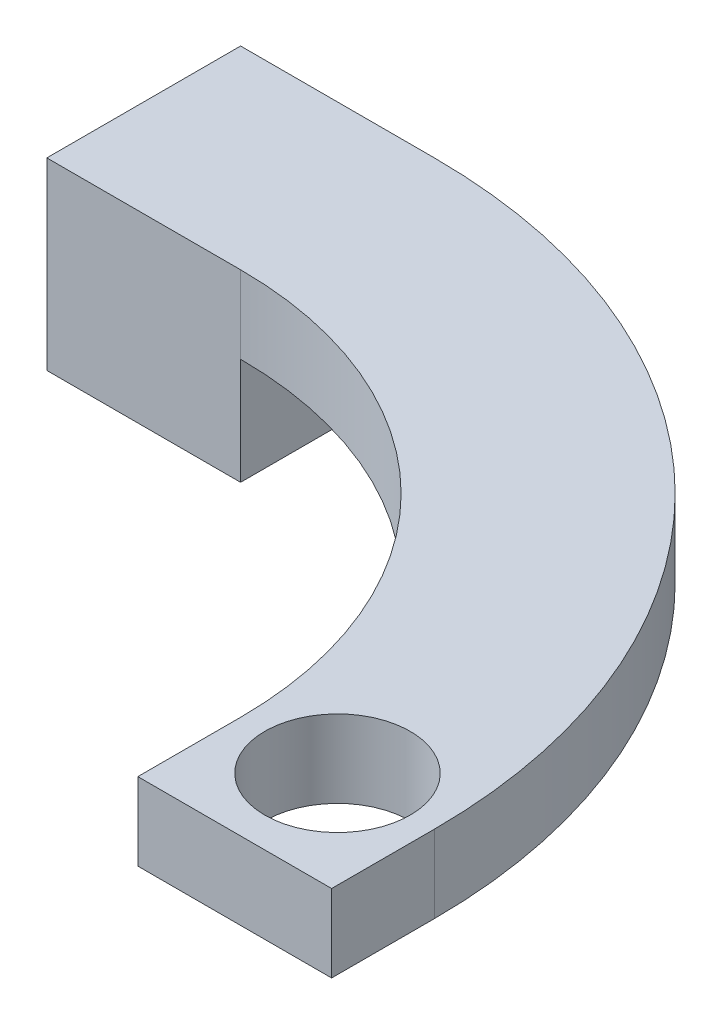
ISO-10303-21;
HEADER;
FILE_DESCRIPTION(('STEP AP214'),'2;1');
FILE_NAME('part.step','',(''),(''),'','','');
FILE_SCHEMA(('AUTOMOTIVE_DESIGN { 1 0 10303 214 1 1 1 1 }'));
ENDSEC;
DATA;
#1=APPLICATION_CONTEXT('core data for automotive mechanical design processes');
#2=APPLICATION_PROTOCOL_DEFINITION('international standard','automotive_design',2000,#1);
#3=PRODUCT_CONTEXT('',#1,'mechanical');
#4=PRODUCT('Part','Part','',(#3));
#5=PRODUCT_RELATED_PRODUCT_CATEGORY('part','',(#4));
#6=PRODUCT_DEFINITION_FORMATION('','',#4);
#7=PRODUCT_DEFINITION_CONTEXT('part definition',#1,'design');
#8=PRODUCT_DEFINITION('design','',#6,#7);
#9=PRODUCT_DEFINITION_SHAPE('','',#8);
#10=(LENGTH_UNIT() NAMED_UNIT(*) SI_UNIT(.MILLI.,.METRE.));
#11=(NAMED_UNIT(*) PLANE_ANGLE_UNIT() SI_UNIT($,.RADIAN.));
#12=(NAMED_UNIT(*) SI_UNIT($,.STERADIAN.) SOLID_ANGLE_UNIT());
#13=UNCERTAINTY_MEASURE_WITH_UNIT(LENGTH_MEASURE(1.E-05),#10,'distance_accuracy_value','');
#14=(GEOMETRIC_REPRESENTATION_CONTEXT(3) GLOBAL_UNCERTAINTY_ASSIGNED_CONTEXT((#13)) GLOBAL_UNIT_ASSIGNED_CONTEXT((#10,
#11,#12)) REPRESENTATION_CONTEXT('',''));
#15=CARTESIAN_POINT('',(0.,0.,0.));
#16=DIRECTION('',(0.,0.,1.));
#17=DIRECTION('',(1.,0.,0.));
#18=AXIS2_PLACEMENT_3D('',#15,#16,#17);
#19=CARTESIAN_POINT('',(0.,0.,0.));
#20=DIRECTION('',(0.,1.,0.));
#21=DIRECTION('',(0.,0.,1.));
#22=AXIS2_PLACEMENT_3D('',#19,#20,#21);
#23=PLANE('',#22);
#24=CARTESIAN_POINT('',(60.6066017177982,0.,-10.6066017177982));
#25=DIRECTION('',(0.,1.,0.));
#26=DIRECTION('',(0.,0.,1.));
#27=AXIS2_PLACEMENT_3D('',#24,#25,#26);
#28=CIRCLE('',#27,7.50000000000001);
#29=CARTESIAN_POINT('',(60.6066017177982,0.,-3.1066017177982));
#30=VERTEX_POINT('',#29);
#31=EDGE_CURVE('E129',#30,#30,#28,.T.);
#32=ORIENTED_EDGE('',*,*,#31,.T.);
#33=EDGE_LOOP('',(#32));
#34=FACE_BOUND('',#33,.T.);
#35=DIRECTION('',(0.,0.,1.));
#36=VECTOR('',#35,1.);
#37=CARTESIAN_POINT('',(10.6066017177982,0.,-50.6066017177982));
#38=LINE('',#37,#36);
#39=CARTESIAN_POINT('',(10.6066017177982,0.,-70.6066017177982));
#40=VERTEX_POINT('',#39);
#41=CARTESIAN_POINT('',(10.6066017177982,0.,-50.6066017177982));
#42=VERTEX_POINT('',#41);
#43=EDGE_CURVE('E166',#40,#42,#38,.T.);
#44=ORIENTED_EDGE('',*,*,#43,.F.);
#45=CARTESIAN_POINT('',(10.6066017177982,0.,-10.6066017177982));
#46=DIRECTION('',(0.,1.,0.));
#47=DIRECTION('',(0.,0.,1.));
#48=AXIS2_PLACEMENT_3D('',#45,#46,#47);
#49=CIRCLE('',#48,60.);
#50=CARTESIAN_POINT('',(70.6066017177982,0.,-10.6066017177982));
#51=VERTEX_POINT('',#50);
#52=EDGE_CURVE('E136',#51,#40,#49,.T.);
#53=ORIENTED_EDGE('',*,*,#52,.F.);
#54=DIRECTION('',(0.,0.,-1.));
#55=VECTOR('',#54,1.);
#56=CARTESIAN_POINT('',(70.6066017177982,0.,0.));
#57=LINE('',#56,#55);
#58=CARTESIAN_POINT('',(70.6066017177982,0.,0.));
#59=VERTEX_POINT('',#58);
#60=EDGE_CURVE('E132',#59,#51,#57,.T.);
#61=ORIENTED_EDGE('',*,*,#60,.F.);
#62=DIRECTION('',(1.,0.,0.));
#63=VECTOR('',#62,1.);
#64=CARTESIAN_POINT('',(0.,0.,0.));
#65=LINE('',#64,#63);
#66=CARTESIAN_POINT('',(50.6066017177982,0.,0.));
#67=VERTEX_POINT('',#66);
#68=EDGE_CURVE('E78',#67,#59,#65,.T.);
#69=ORIENTED_EDGE('',*,*,#68,.F.);
#70=DIRECTION('',(0.,0.,1.));
#71=VECTOR('',#70,1.);
#72=CARTESIAN_POINT('',(50.6066017177982,0.,0.));
#73=LINE('',#72,#71);
#74=CARTESIAN_POINT('',(50.6066017177982,0.,-10.6066017177982));
#75=VERTEX_POINT('',#74);
#76=EDGE_CURVE('E72',#75,#67,#73,.T.);
#77=ORIENTED_EDGE('',*,*,#76,.F.);
#78=CARTESIAN_POINT('',(10.6066017177982,0.,-10.6066017177982));
#79=DIRECTION('',(0.,1.,0.));
#80=DIRECTION('',(0.,0.,1.));
#81=AXIS2_PLACEMENT_3D('',#78,#79,#80);
#82=CIRCLE('',#81,40.);
#83=EDGE_CURVE('E111',#75,#42,#82,.T.);
#84=ORIENTED_EDGE('',*,*,#83,.T.);
#85=EDGE_LOOP('',(#44,#53,#61,#69,#77,#84));
#86=FACE_BOUND('',#85,.T.);
#87=ADVANCED_FACE('F35',(#34,#86),#23,.F.);
#88=CARTESIAN_POINT('',(70.6066017177982,8.,0.));
#89=DIRECTION('',(-1.,0.,0.));
#90=DIRECTION('',(0.,0.,1.));
#91=AXIS2_PLACEMENT_3D('',#88,#89,#90);
#92=PLANE('',#91);
#93=ORIENTED_EDGE('',*,*,#60,.T.);
#94=DIRECTION('',(0.,-1.,0.));
#95=VECTOR('',#94,1.);
#96=CARTESIAN_POINT('',(70.6066017177982,8.,-10.6066017177982));
#97=LINE('',#96,#95);
#98=CARTESIAN_POINT('',(70.6066017177982,8.,-10.6066017177982));
#99=VERTEX_POINT('',#98);
#100=EDGE_CURVE('E11',#99,#51,#97,.T.);
#101=ORIENTED_EDGE('',*,*,#100,.F.);
#102=DIRECTION('',(0.,0.,-1.));
#103=VECTOR('',#102,1.);
#104=CARTESIAN_POINT('',(70.6066017177982,8.,0.));
#105=LINE('',#104,#103);
#106=CARTESIAN_POINT('',(70.6066017177982,8.,0.));
#107=VERTEX_POINT('',#106);
#108=EDGE_CURVE('E178',#107,#99,#105,.T.);
#109=ORIENTED_EDGE('',*,*,#108,.F.);
#110=DIRECTION('',(0.,-1.,0.));
#111=VECTOR('',#110,1.);
#112=CARTESIAN_POINT('',(70.6066017177982,8.,0.));
#113=LINE('',#112,#111);
#114=EDGE_CURVE('E128',#107,#59,#113,.T.);
#115=ORIENTED_EDGE('',*,*,#114,.T.);
#116=EDGE_LOOP('',(#93,#101,#109,#115));
#117=FACE_BOUND('',#116,.T.);
#118=ADVANCED_FACE('F263',(#117),#92,.F.);
#119=CARTESIAN_POINT('',(10.6066017177982,8.,-10.6066017177982));
#120=DIRECTION('',(0.,-1.,0.));
#121=DIRECTION('',(0.,0.,-1.));
#122=AXIS2_PLACEMENT_3D('',#119,#120,#121);
#123=CYLINDRICAL_SURFACE('',#122,60.);
#124=ORIENTED_EDGE('',*,*,#52,.T.);
#125=DIRECTION('',(0.,-1.,0.));
#126=VECTOR('',#125,1.);
#127=CARTESIAN_POINT('',(10.6066017177982,8.,-70.6066017177982));
#128=LINE('',#127,#126);
#129=CARTESIAN_POINT('',(10.6066017177982,8.,-70.6066017177982));
#130=VERTEX_POINT('',#129);
#131=EDGE_CURVE('E44',#130,#40,#128,.T.);
#132=ORIENTED_EDGE('',*,*,#131,.F.);
#133=CARTESIAN_POINT('',(10.6066017177982,8.,-10.6066017177982));
#134=DIRECTION('',(0.,1.,0.));
#135=DIRECTION('',(0.,0.,1.));
#136=AXIS2_PLACEMENT_3D('',#133,#134,#135);
#137=CIRCLE('',#136,60.);
#138=EDGE_CURVE('E86',#99,#130,#137,.T.);
#139=ORIENTED_EDGE('',*,*,#138,.F.);
#140=ORIENTED_EDGE('',*,*,#100,.T.);
#141=EDGE_LOOP('',(#124,#132,#139,#140));
#142=FACE_BOUND('',#141,.T.);
#143=ADVANCED_FACE('F269',(#142),#123,.T.);
#144=CARTESIAN_POINT('',(0.,8.,-70.6066017177982));
#145=DIRECTION('',(0.,0.,1.));
#146=DIRECTION('',(1.,0.,0.));
#147=AXIS2_PLACEMENT_3D('',#144,#145,#146);
#148=PLANE('',#147);
#149=ORIENTED_EDGE('',*,*,#131,.T.);
#150=DIRECTION('',(0.,1.,0.));
#151=VECTOR('',#150,1.);
#152=CARTESIAN_POINT('',(10.6066017177982,-11.,-70.6066017177982));
#153=LINE('',#152,#151);
#154=CARTESIAN_POINT('',(10.6066017177982,-11.,-70.6066017177982));
#155=VERTEX_POINT('',#154);
#156=EDGE_CURVE('E133',#155,#40,#153,.T.);
#157=ORIENTED_EDGE('',*,*,#156,.F.);
#158=DIRECTION('',(1.,0.,0.));
#159=VECTOR('',#158,1.);
#160=CARTESIAN_POINT('',(-9.39339828220177,-11.,-70.6066017177982));
#161=LINE('',#160,#159);
#162=CARTESIAN_POINT('',(-9.39339828220177,-11.,-70.6066017177982));
#163=VERTEX_POINT('',#162);
#164=EDGE_CURVE('E201',#163,#155,#161,.T.);
#165=ORIENTED_EDGE('',*,*,#164,.F.);
#166=DIRECTION('',(0.,-1.,0.));
#167=VECTOR('',#166,1.);
#168=CARTESIAN_POINT('',(-9.39339828220177,8.,-70.6066017177982));
#169=LINE('',#168,#167);
#170=CARTESIAN_POINT('',(-9.39339828220177,8.,-70.6066017177982));
#171=VERTEX_POINT('',#170);
#172=EDGE_CURVE('E149',#171,#163,#169,.T.);
#173=ORIENTED_EDGE('',*,*,#172,.F.);
#174=DIRECTION('',(-1.,0.,0.));
#175=VECTOR('',#174,1.);
#176=CARTESIAN_POINT('',(0.,8.,-70.6066017177982));
#177=LINE('',#176,#175);
#178=EDGE_CURVE('E161',#130,#171,#177,.T.);
#179=ORIENTED_EDGE('',*,*,#178,.F.);
#180=EDGE_LOOP('',(#149,#157,#165,#173,#179));
#181=FACE_BOUND('',#180,.T.);
#182=ADVANCED_FACE('F156',(#181),#148,.F.);
#183=CARTESIAN_POINT('',(-9.39339828220177,8.,0.));
#184=DIRECTION('',(1.,0.,0.));
#185=DIRECTION('',(0.,0.,-1.));
#186=AXIS2_PLACEMENT_3D('',#183,#184,#185);
#187=PLANE('',#186);
#188=ORIENTED_EDGE('',*,*,#172,.T.);
#189=DIRECTION('',(0.,0.,-1.));
#190=VECTOR('',#189,1.);
#191=CARTESIAN_POINT('',(-9.39339828220177,-11.,-50.6066017177982));
#192=LINE('',#191,#190);
#193=CARTESIAN_POINT('',(-9.39339828220177,-11.,-50.6066017177982));
#194=VERTEX_POINT('',#193);
#195=EDGE_CURVE('E187',#194,#163,#192,.T.);
#196=ORIENTED_EDGE('',*,*,#195,.F.);
#197=DIRECTION('',(0.,-1.,0.));
#198=VECTOR('',#197,1.);
#199=CARTESIAN_POINT('',(-9.39339828220177,8.,-50.6066017177982));
#200=LINE('',#199,#198);
#201=CARTESIAN_POINT('',(-9.39339828220177,8.,-50.6066017177982));
#202=VERTEX_POINT('',#201);
#203=EDGE_CURVE('E146',#202,#194,#200,.T.);
#204=ORIENTED_EDGE('',*,*,#203,.F.);
#205=DIRECTION('',(0.,0.,1.));
#206=VECTOR('',#205,1.);
#207=CARTESIAN_POINT('',(-9.39339828220177,8.,0.));
#208=LINE('',#207,#206);
#209=EDGE_CURVE('E123',#171,#202,#208,.T.);
#210=ORIENTED_EDGE('',*,*,#209,.F.);
#211=EDGE_LOOP('',(#188,#196,#204,#210));
#212=FACE_BOUND('',#211,.T.);
#213=ADVANCED_FACE('F185',(#212),#187,.F.);
#214=CARTESIAN_POINT('',(0.,8.,-50.6066017177982));
#215=DIRECTION('',(0.,0.,-1.));
#216=DIRECTION('',(-1.,0.,0.));
#217=AXIS2_PLACEMENT_3D('',#214,#215,#216);
#218=PLANE('',#217);
#219=ORIENTED_EDGE('',*,*,#203,.T.);
#220=DIRECTION('',(-1.,0.,0.));
#221=VECTOR('',#220,1.);
#222=CARTESIAN_POINT('',(-9.39339828220177,-11.,-50.6066017177982));
#223=LINE('',#222,#221);
#224=CARTESIAN_POINT('',(10.6066017177982,-11.,-50.6066017177982));
#225=VERTEX_POINT('',#224);
#226=EDGE_CURVE('E172',#225,#194,#223,.T.);
#227=ORIENTED_EDGE('',*,*,#226,.F.);
#228=DIRECTION('',(0.,1.,0.));
#229=VECTOR('',#228,1.);
#230=CARTESIAN_POINT('',(10.6066017177982,-11.,-50.6066017177982));
#231=LINE('',#230,#229);
#232=EDGE_CURVE('E170',#225,#42,#231,.T.);
#233=ORIENTED_EDGE('',*,*,#232,.T.);
#234=DIRECTION('',(0.,-1.,0.));
#235=VECTOR('',#234,1.);
#236=CARTESIAN_POINT('',(10.6066017177982,8.,-50.6066017177982));
#237=LINE('',#236,#235);
#238=CARTESIAN_POINT('',(10.6066017177982,8.,-50.6066017177982));
#239=VERTEX_POINT('',#238);
#240=EDGE_CURVE('E112',#239,#42,#237,.T.);
#241=ORIENTED_EDGE('',*,*,#240,.F.);
#242=DIRECTION('',(1.,0.,0.));
#243=VECTOR('',#242,1.);
#244=CARTESIAN_POINT('',(0.,8.,-50.6066017177982));
#245=LINE('',#244,#243);
#246=EDGE_CURVE('E120',#202,#239,#245,.T.);
#247=ORIENTED_EDGE('',*,*,#246,.F.);
#248=EDGE_LOOP('',(#219,#227,#233,#241,#247));
#249=FACE_BOUND('',#248,.T.);
#250=ADVANCED_FACE('F191',(#249),#218,.F.);
#251=CARTESIAN_POINT('',(10.6066017177982,8.,-10.6066017177982));
#252=DIRECTION('',(0.,-1.,0.));
#253=DIRECTION('',(0.,0.,-1.));
#254=AXIS2_PLACEMENT_3D('',#251,#252,#253);
#255=CYLINDRICAL_SURFACE('',#254,40.);
#256=ORIENTED_EDGE('',*,*,#83,.F.);
#257=DIRECTION('',(0.,-1.,0.));
#258=VECTOR('',#257,1.);
#259=CARTESIAN_POINT('',(50.6066017177982,8.,-10.6066017177982));
#260=LINE('',#259,#258);
#261=CARTESIAN_POINT('',(50.6066017177982,8.,-10.6066017177982));
#262=VERTEX_POINT('',#261);
#263=EDGE_CURVE('E104',#262,#75,#260,.T.);
#264=ORIENTED_EDGE('',*,*,#263,.F.);
#265=CARTESIAN_POINT('',(10.6066017177982,8.,-10.6066017177982));
#266=DIRECTION('',(0.,1.,0.));
#267=DIRECTION('',(0.,0.,1.));
#268=AXIS2_PLACEMENT_3D('',#265,#266,#267);
#269=CIRCLE('',#268,40.);
#270=EDGE_CURVE('E109',#262,#239,#269,.T.);
#271=ORIENTED_EDGE('',*,*,#270,.T.);
#272=ORIENTED_EDGE('',*,*,#240,.T.);
#273=EDGE_LOOP('',(#256,#264,#271,#272));
#274=FACE_BOUND('',#273,.T.);
#275=ADVANCED_FACE('F106',(#274),#255,.F.);
#276=CARTESIAN_POINT('',(50.6066017177982,8.,0.));
#277=DIRECTION('',(1.,0.,0.));
#278=DIRECTION('',(0.,0.,-1.));
#279=AXIS2_PLACEMENT_3D('',#276,#277,#278);
#280=PLANE('',#279);
#281=ORIENTED_EDGE('',*,*,#76,.T.);
#282=DIRECTION('',(0.,-1.,0.));
#283=VECTOR('',#282,1.);
#284=CARTESIAN_POINT('',(50.6066017177982,8.,0.));
#285=LINE('',#284,#283);
#286=CARTESIAN_POINT('',(50.6066017177982,8.,0.));
#287=VERTEX_POINT('',#286);
#288=EDGE_CURVE('E113',#287,#67,#285,.T.);
#289=ORIENTED_EDGE('',*,*,#288,.F.);
#290=DIRECTION('',(0.,0.,1.));
#291=VECTOR('',#290,1.);
#292=CARTESIAN_POINT('',(50.6066017177982,8.,0.));
#293=LINE('',#292,#291);
#294=EDGE_CURVE('E115',#262,#287,#293,.T.);
#295=ORIENTED_EDGE('',*,*,#294,.F.);
#296=ORIENTED_EDGE('',*,*,#263,.T.);
#297=EDGE_LOOP('',(#281,#289,#295,#296));
#298=FACE_BOUND('',#297,.T.);
#299=ADVANCED_FACE('F116',(#298),#280,.F.);
#300=CARTESIAN_POINT('',(60.6066017177982,8.,-10.6066017177982));
#301=DIRECTION('',(0.,-1.,0.));
#302=DIRECTION('',(0.,0.,-1.));
#303=AXIS2_PLACEMENT_3D('',#300,#301,#302);
#304=CYLINDRICAL_SURFACE('',#303,7.50000000000001);
#305=CARTESIAN_POINT('',(60.6066017177982,8.,-10.6066017177982));
#306=DIRECTION('',(0.,1.,0.));
#307=DIRECTION('',(0.,0.,1.));
#308=AXIS2_PLACEMENT_3D('',#305,#306,#307);
#309=CIRCLE('',#308,7.50000000000001);
#310=CARTESIAN_POINT('',(60.6066017177982,8.,-3.1066017177982));
#311=VERTEX_POINT('',#310);
#312=EDGE_CURVE('E142',#311,#311,#309,.T.);
#313=ORIENTED_EDGE('',*,*,#312,.T.);
#314=EDGE_LOOP('',(#313));
#315=FACE_BOUND('',#314,.T.);
#316=ORIENTED_EDGE('',*,*,#31,.F.);
#317=EDGE_LOOP('',(#316));
#318=FACE_BOUND('',#317,.T.);
#319=ADVANCED_FACE('F37',(#315,#318),#304,.F.);
#320=CARTESIAN_POINT('',(0.,8.,0.));
#321=DIRECTION('',(0.,0.,-1.));
#322=DIRECTION('',(-1.,0.,0.));
#323=AXIS2_PLACEMENT_3D('',#320,#321,#322);
#324=PLANE('',#323);
#325=ORIENTED_EDGE('',*,*,#68,.T.);
#326=ORIENTED_EDGE('',*,*,#114,.F.);
#327=DIRECTION('',(1.,0.,0.));
#328=VECTOR('',#327,1.);
#329=CARTESIAN_POINT('',(0.,8.,0.));
#330=LINE('',#329,#328);
#331=EDGE_CURVE('E52',#287,#107,#330,.T.);
#332=ORIENTED_EDGE('',*,*,#331,.F.);
#333=ORIENTED_EDGE('',*,*,#288,.T.);
#334=EDGE_LOOP('',(#325,#326,#332,#333));
#335=FACE_BOUND('',#334,.T.);
#336=ADVANCED_FACE('F274',(#335),#324,.F.);
#337=CARTESIAN_POINT('',(0.,8.,0.));
#338=DIRECTION('',(0.,1.,0.));
#339=DIRECTION('',(0.,0.,1.));
#340=AXIS2_PLACEMENT_3D('',#337,#338,#339);
#341=PLANE('',#340);
#342=ORIENTED_EDGE('',*,*,#312,.F.);
#343=EDGE_LOOP('',(#342));
#344=FACE_BOUND('',#343,.T.);
#345=ORIENTED_EDGE('',*,*,#108,.T.);
#346=ORIENTED_EDGE('',*,*,#138,.T.);
#347=ORIENTED_EDGE('',*,*,#178,.T.);
#348=ORIENTED_EDGE('',*,*,#209,.T.);
#349=ORIENTED_EDGE('',*,*,#246,.T.);
#350=ORIENTED_EDGE('',*,*,#270,.F.);
#351=ORIENTED_EDGE('',*,*,#294,.T.);
#352=ORIENTED_EDGE('',*,*,#331,.T.);
#353=EDGE_LOOP('',(#345,#346,#347,#348,#349,#350,#351,#352));
#354=FACE_BOUND('',#353,.T.);
#355=ADVANCED_FACE('F118',(#344,#354),#341,.T.);
#356=CARTESIAN_POINT('',(10.6066017177982,-11.,-50.6066017177982));
#357=DIRECTION('',(-1.,0.,0.));
#358=DIRECTION('',(0.,0.,1.));
#359=AXIS2_PLACEMENT_3D('',#356,#357,#358);
#360=PLANE('',#359);
#361=ORIENTED_EDGE('',*,*,#43,.T.);
#362=ORIENTED_EDGE('',*,*,#232,.F.);
#363=DIRECTION('',(0.,0.,1.));
#364=VECTOR('',#363,1.);
#365=CARTESIAN_POINT('',(10.6066017177982,-11.,-50.6066017177982));
#366=LINE('',#365,#364);
#367=EDGE_CURVE('E169',#155,#225,#366,.T.);
#368=ORIENTED_EDGE('',*,*,#367,.F.);
#369=ORIENTED_EDGE('',*,*,#156,.T.);
#370=EDGE_LOOP('',(#361,#362,#368,#369));
#371=FACE_BOUND('',#370,.T.);
#372=ADVANCED_FACE('F164',(#371),#360,.F.);
#373=CARTESIAN_POINT('',(0.,-11.,0.));
#374=DIRECTION('',(0.,-1.,0.));
#375=DIRECTION('',(0.,0.,-1.));
#376=AXIS2_PLACEMENT_3D('',#373,#374,#375);
#377=PLANE('',#376);
#378=CARTESIAN_POINT('',(6.60660171779823,-11.,-60.6066017177982));
#379=DIRECTION('',(0.,-1.,0.));
#380=DIRECTION('',(0.,0.,1.));
#381=AXIS2_PLACEMENT_3D('',#378,#379,#380);
#382=CIRCLE('',#381,1.5);
#383=CARTESIAN_POINT('',(6.60660171779823,-11.,-59.1066017177982));
#384=VERTEX_POINT('',#383);
#385=EDGE_CURVE('E228',#384,#384,#382,.T.);
#386=ORIENTED_EDGE('',*,*,#385,.F.);
#387=EDGE_LOOP('',(#386));
#388=FACE_BOUND('',#387,.T.);
#389=CARTESIAN_POINT('',(0.606601717798227,-11.,-66.6066017177982));
#390=DIRECTION('',(0.,-1.,0.));
#391=DIRECTION('',(0.,0.,-1.));
#392=AXIS2_PLACEMENT_3D('',#389,#390,#391);
#393=CIRCLE('',#392,1.5);
#394=CARTESIAN_POINT('',(0.606601717798227,-11.,-68.1066017177982));
#395=VERTEX_POINT('',#394);
#396=EDGE_CURVE('E222',#395,#395,#393,.T.);
#397=ORIENTED_EDGE('',*,*,#396,.F.);
#398=EDGE_LOOP('',(#397));
#399=FACE_BOUND('',#398,.T.);
#400=CARTESIAN_POINT('',(0.606601717798227,-11.,-54.6066017177982));
#401=DIRECTION('',(0.,-1.,0.));
#402=DIRECTION('',(0.,0.,1.));
#403=AXIS2_PLACEMENT_3D('',#400,#401,#402);
#404=CIRCLE('',#403,1.5);
#405=CARTESIAN_POINT('',(0.606601717798227,-11.,-53.1066017177982));
#406=VERTEX_POINT('',#405);
#407=EDGE_CURVE('E216',#406,#406,#404,.T.);
#408=ORIENTED_EDGE('',*,*,#407,.F.);
#409=EDGE_LOOP('',(#408));
#410=FACE_BOUND('',#409,.T.);
#411=CARTESIAN_POINT('',(-5.39339828220177,-11.,-60.6066017177982));
#412=DIRECTION('',(0.,-1.,0.));
#413=DIRECTION('',(0.,0.,-1.));
#414=AXIS2_PLACEMENT_3D('',#411,#412,#413);
#415=CIRCLE('',#414,1.5);
#416=CARTESIAN_POINT('',(-5.39339828220177,-11.,-62.1066017177982));
#417=VERTEX_POINT('',#416);
#418=EDGE_CURVE('E208',#417,#417,#415,.T.);
#419=ORIENTED_EDGE('',*,*,#418,.F.);
#420=EDGE_LOOP('',(#419));
#421=FACE_BOUND('',#420,.T.);
#422=ORIENTED_EDGE('',*,*,#195,.T.);
#423=ORIENTED_EDGE('',*,*,#164,.T.);
#424=ORIENTED_EDGE('',*,*,#367,.T.);
#425=ORIENTED_EDGE('',*,*,#226,.T.);
#426=EDGE_LOOP('',(#422,#423,#424,#425));
#427=FACE_BOUND('',#426,.T.);
#428=ADVANCED_FACE('F200',(#388,#399,#410,#421,#427),#377,.T.);
#429=CARTESIAN_POINT('',(-5.39339828220177,-0.999999999999999,-60.6066017177982));
#430=DIRECTION('',(0.,-1.,0.));
#431=DIRECTION('',(0.,0.,-1.));
#432=AXIS2_PLACEMENT_3D('',#429,#430,#431);
#433=CYLINDRICAL_SURFACE('',#432,1.5);
#434=CARTESIAN_POINT('',(-5.39339828220177,-0.999999999999999,-60.6066017177982));
#435=DIRECTION('',(0.,-1.,0.));
#436=DIRECTION('',(0.,0.,-1.));
#437=AXIS2_PLACEMENT_3D('',#434,#435,#436);
#438=CIRCLE('',#437,1.5);
#439=CARTESIAN_POINT('',(-5.39339828220177,-0.999999999999999,-62.1066017177982));
#440=VERTEX_POINT('',#439);
#441=EDGE_CURVE('E205',#440,#440,#438,.T.);
#442=ORIENTED_EDGE('',*,*,#441,.F.);
#443=EDGE_LOOP('',(#442));
#444=FACE_BOUND('',#443,.T.);
#445=ORIENTED_EDGE('',*,*,#418,.T.);
#446=EDGE_LOOP('',(#445));
#447=FACE_BOUND('',#446,.T.);
#448=ADVANCED_FACE('F245',(#444,#447),#433,.F.);
#449=CARTESIAN_POINT('',(-5.39339828220177,-0.999999999999999,-60.6066017177982));
#450=DIRECTION('',(0.,-1.,0.));
#451=DIRECTION('',(0.,0.,-1.));
#452=AXIS2_PLACEMENT_3D('',#449,#450,#451);
#453=PLANE('',#452);
#454=ORIENTED_EDGE('',*,*,#441,.T.);
#455=EDGE_LOOP('',(#454));
#456=FACE_BOUND('',#455,.T.);
#457=ADVANCED_FACE('F254',(#456),#453,.T.);
#458=CARTESIAN_POINT('',(0.606601717798227,-0.999999999999999,-54.6066017177982));
#459=DIRECTION('',(0.,-1.,0.));
#460=DIRECTION('',(0.,0.,-1.));
#461=AXIS2_PLACEMENT_3D('',#458,#459,#460);
#462=CYLINDRICAL_SURFACE('',#461,1.5);
#463=CARTESIAN_POINT('',(0.606601717798227,-0.999999999999999,-54.6066017177982));
#464=DIRECTION('',(0.,-1.,0.));
#465=DIRECTION('',(0.,0.,1.));
#466=AXIS2_PLACEMENT_3D('',#463,#464,#465);
#467=CIRCLE('',#466,1.5);
#468=CARTESIAN_POINT('',(0.606601717798227,-0.999999999999999,-53.1066017177982));
#469=VERTEX_POINT('',#468);
#470=EDGE_CURVE('E219',#469,#469,#467,.T.);
#471=ORIENTED_EDGE('',*,*,#470,.F.);
#472=EDGE_LOOP('',(#471));
#473=FACE_BOUND('',#472,.T.);
#474=ORIENTED_EDGE('',*,*,#407,.T.);
#475=EDGE_LOOP('',(#474));
#476=FACE_BOUND('',#475,.T.);
#477=ADVANCED_FACE('F260',(#473,#476),#462,.F.);
#478=CARTESIAN_POINT('',(0.606601717798227,-0.999999999999999,-54.6066017177982));
#479=DIRECTION('',(0.,1.,0.));
#480=DIRECTION('',(0.,0.,1.));
#481=AXIS2_PLACEMENT_3D('',#478,#479,#480);
#482=PLANE('',#481);
#483=ORIENTED_EDGE('',*,*,#470,.T.);
#484=EDGE_LOOP('',(#483));
#485=FACE_BOUND('',#484,.T.);
#486=ADVANCED_FACE('F359',(#485),#482,.F.);
#487=CARTESIAN_POINT('',(0.606601717798227,-0.999999999999999,-66.6066017177982));
#488=DIRECTION('',(0.,-1.,0.));
#489=DIRECTION('',(0.,0.,-1.));
#490=AXIS2_PLACEMENT_3D('',#487,#488,#489);
#491=CYLINDRICAL_SURFACE('',#490,1.5);
#492=CARTESIAN_POINT('',(0.606601717798227,-0.999999999999999,-66.6066017177982));
#493=DIRECTION('',(0.,-1.,0.));
#494=DIRECTION('',(0.,0.,-1.));
#495=AXIS2_PLACEMENT_3D('',#492,#493,#494);
#496=CIRCLE('',#495,1.5);
#497=CARTESIAN_POINT('',(0.606601717798227,-0.999999999999999,-68.1066017177982));
#498=VERTEX_POINT('',#497);
#499=EDGE_CURVE('E225',#498,#498,#496,.T.);
#500=ORIENTED_EDGE('',*,*,#499,.F.);
#501=EDGE_LOOP('',(#500));
#502=FACE_BOUND('',#501,.T.);
#503=ORIENTED_EDGE('',*,*,#396,.T.);
#504=EDGE_LOOP('',(#503));
#505=FACE_BOUND('',#504,.T.);
#506=ADVANCED_FACE('F369',(#502,#505),#491,.F.);
#507=CARTESIAN_POINT('',(0.606601717798227,-0.999999999999999,-66.6066017177982));
#508=DIRECTION('',(0.,-1.,0.));
#509=DIRECTION('',(0.,0.,-1.));
#510=AXIS2_PLACEMENT_3D('',#507,#508,#509);
#511=PLANE('',#510);
#512=ORIENTED_EDGE('',*,*,#499,.T.);
#513=EDGE_LOOP('',(#512));
#514=FACE_BOUND('',#513,.T.);
#515=ADVANCED_FACE('F239',(#514),#511,.T.);
#516=CARTESIAN_POINT('',(6.60660171779823,-0.999999999999999,-60.6066017177982));
#517=DIRECTION('',(0.,-1.,0.));
#518=DIRECTION('',(0.,0.,-1.));
#519=AXIS2_PLACEMENT_3D('',#516,#517,#518);
#520=CYLINDRICAL_SURFACE('',#519,1.5);
#521=CARTESIAN_POINT('',(6.60660171779823,-0.999999999999999,-60.6066017177982));
#522=DIRECTION('',(0.,-1.,0.));
#523=DIRECTION('',(0.,0.,1.));
#524=AXIS2_PLACEMENT_3D('',#521,#522,#523);
#525=CIRCLE('',#524,1.5);
#526=CARTESIAN_POINT('',(6.60660171779823,-0.999999999999999,-59.1066017177982));
#527=VERTEX_POINT('',#526);
#528=EDGE_CURVE('E213',#527,#527,#525,.T.);
#529=ORIENTED_EDGE('',*,*,#528,.F.);
#530=EDGE_LOOP('',(#529));
#531=FACE_BOUND('',#530,.T.);
#532=ORIENTED_EDGE('',*,*,#385,.T.);
#533=EDGE_LOOP('',(#532));
#534=FACE_BOUND('',#533,.T.);
#535=ADVANCED_FACE('F236',(#531,#534),#520,.F.);
#536=CARTESIAN_POINT('',(6.60660171779823,-0.999999999999999,-60.6066017177982));
#537=DIRECTION('',(0.,1.,0.));
#538=DIRECTION('',(0.,0.,1.));
#539=AXIS2_PLACEMENT_3D('',#536,#537,#538);
#540=PLANE('',#539);
#541=ORIENTED_EDGE('',*,*,#528,.T.);
#542=EDGE_LOOP('',(#541));
#543=FACE_BOUND('',#542,.T.);
#544=ADVANCED_FACE('F234',(#543),#540,.F.);
#545=CLOSED_SHELL('',(#87,#118,#143,#182,#213,#250,#275,#299,#319,#336,#355,#372,#428,#448,#457,
#477,#486,#506,#515,#535,#544));
#546=MANIFOLD_SOLID_BREP('B2',#545);
#547=ADVANCED_BREP_SHAPE_REPRESENTATION('',(#18,#546),#14);
#548=SHAPE_DEFINITION_REPRESENTATION(#9,#547);
ENDSEC;
END-ISO-10303-21;
